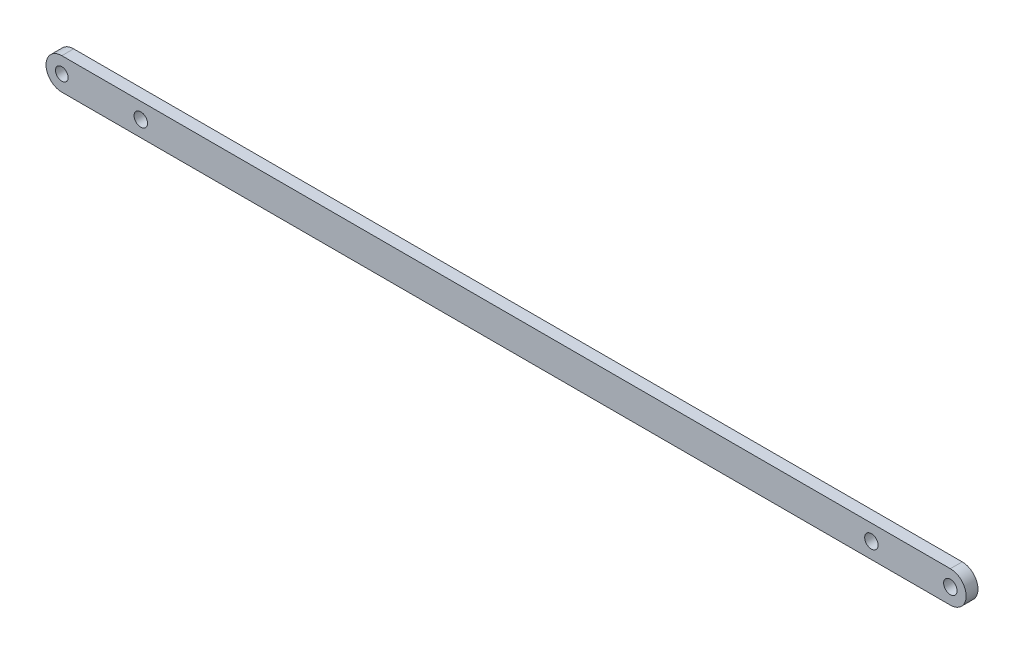
ISO-10303-21;
HEADER;
FILE_DESCRIPTION(('STEP AP214'),'2;1');
FILE_NAME('part.step','',(''),(''),'','','');
FILE_SCHEMA(('AUTOMOTIVE_DESIGN { 1 0 10303 214 1 1 1 1 }'));
ENDSEC;
DATA;
#1=APPLICATION_CONTEXT('core data for automotive mechanical design processes');
#2=APPLICATION_PROTOCOL_DEFINITION('international standard','automotive_design',2000,#1);
#3=PRODUCT_CONTEXT('',#1,'mechanical');
#4=PRODUCT('Part','Part','',(#3));
#5=PRODUCT_RELATED_PRODUCT_CATEGORY('part','',(#4));
#6=PRODUCT_DEFINITION_FORMATION('','',#4);
#7=PRODUCT_DEFINITION_CONTEXT('part definition',#1,'design');
#8=PRODUCT_DEFINITION('design','',#6,#7);
#9=PRODUCT_DEFINITION_SHAPE('','',#8);
#10=(LENGTH_UNIT() NAMED_UNIT(*) SI_UNIT(.MILLI.,.METRE.));
#11=(NAMED_UNIT(*) PLANE_ANGLE_UNIT() SI_UNIT($,.RADIAN.));
#12=(NAMED_UNIT(*) SI_UNIT($,.STERADIAN.) SOLID_ANGLE_UNIT());
#13=UNCERTAINTY_MEASURE_WITH_UNIT(LENGTH_MEASURE(1.E-05),#10,'distance_accuracy_value','');
#14=(GEOMETRIC_REPRESENTATION_CONTEXT(3) GLOBAL_UNCERTAINTY_ASSIGNED_CONTEXT((#13)) GLOBAL_UNIT_ASSIGNED_CONTEXT((#10,
#11,#12)) REPRESENTATION_CONTEXT('',''));
#15=CARTESIAN_POINT('',(0.,0.,0.));
#16=DIRECTION('',(0.,0.,1.));
#17=DIRECTION('',(1.,0.,0.));
#18=AXIS2_PLACEMENT_3D('',#15,#16,#17);
#19=CARTESIAN_POINT('',(171.149757172206,0.,3.));
#20=DIRECTION('',(0.,0.,-1.));
#21=DIRECTION('',(-1.,0.,0.));
#22=AXIS2_PLACEMENT_3D('',#19,#20,#21);
#23=CYLINDRICAL_SURFACE('',#22,4.);
#24=CARTESIAN_POINT('',(171.149757172206,0.,0.));
#25=DIRECTION('',(0.,0.,1.));
#26=DIRECTION('',(1.,0.,0.));
#27=AXIS2_PLACEMENT_3D('',#24,#25,#26);
#28=CIRCLE('',#27,4.);
#29=CARTESIAN_POINT('',(171.149757172206,4.,0.));
#30=VERTEX_POINT('',#29);
#31=CARTESIAN_POINT('',(171.149757172206,-4.,0.));
#32=VERTEX_POINT('',#31);
#33=EDGE_CURVE('E122',#30,#32,#28,.F.);
#34=ORIENTED_EDGE('',*,*,#33,.F.);
#35=DIRECTION('',(0.,0.,-1.));
#36=VECTOR('',#35,1.);
#37=CARTESIAN_POINT('',(171.149757172206,4.,3.));
#38=LINE('',#37,#36);
#39=CARTESIAN_POINT('',(171.149757172206,4.,3.));
#40=VERTEX_POINT('',#39);
#41=EDGE_CURVE('E11',#40,#30,#38,.T.);
#42=ORIENTED_EDGE('',*,*,#41,.F.);
#43=CARTESIAN_POINT('',(171.149757172206,0.,3.));
#44=DIRECTION('',(0.,0.,1.));
#45=DIRECTION('',(1.,0.,0.));
#46=AXIS2_PLACEMENT_3D('',#43,#44,#45);
#47=CIRCLE('',#46,4.);
#48=CARTESIAN_POINT('',(171.149757172206,-4.,3.));
#49=VERTEX_POINT('',#48);
#50=EDGE_CURVE('E103',#40,#49,#47,.F.);
#51=ORIENTED_EDGE('',*,*,#50,.T.);
#52=DIRECTION('',(0.,0.,-1.));
#53=VECTOR('',#52,1.);
#54=CARTESIAN_POINT('',(171.149757172206,-4.,3.));
#55=LINE('',#54,#53);
#56=EDGE_CURVE('E81',#49,#32,#55,.T.);
#57=ORIENTED_EDGE('',*,*,#56,.T.);
#58=EDGE_LOOP('',(#34,#42,#51,#57));
#59=FACE_BOUND('',#58,.T.);
#60=ADVANCED_FACE('F41',(#59),#23,.T.);
#61=CARTESIAN_POINT('',(0.,4.,3.));
#62=DIRECTION('',(0.,1.,0.));
#63=DIRECTION('',(-1.,0.,0.));
#64=AXIS2_PLACEMENT_3D('',#61,#62,#63);
#65=PLANE('',#64);
#66=DIRECTION('',(1.,0.,0.));
#67=VECTOR('',#66,1.);
#68=CARTESIAN_POINT('',(0.,4.,0.));
#69=LINE('',#68,#67);
#70=CARTESIAN_POINT('',(-53.8502428277937,4.,0.));
#71=VERTEX_POINT('',#70);
#72=EDGE_CURVE('E93',#71,#30,#69,.T.);
#73=ORIENTED_EDGE('',*,*,#72,.F.);
#74=DIRECTION('',(0.,0.,-1.));
#75=VECTOR('',#74,1.);
#76=CARTESIAN_POINT('',(-53.8502428277937,4.,3.));
#77=LINE('',#76,#75);
#78=CARTESIAN_POINT('',(-53.8502428277937,4.,3.));
#79=VERTEX_POINT('',#78);
#80=EDGE_CURVE('E50',#79,#71,#77,.T.);
#81=ORIENTED_EDGE('',*,*,#80,.F.);
#82=DIRECTION('',(1.,0.,0.));
#83=VECTOR('',#82,1.);
#84=CARTESIAN_POINT('',(0.,4.,3.));
#85=LINE('',#84,#83);
#86=EDGE_CURVE('E91',#79,#40,#85,.T.);
#87=ORIENTED_EDGE('',*,*,#86,.T.);
#88=ORIENTED_EDGE('',*,*,#41,.T.);
#89=EDGE_LOOP('',(#73,#81,#87,#88));
#90=FACE_BOUND('',#89,.T.);
#91=ADVANCED_FACE('F89',(#90),#65,.T.);
#92=CARTESIAN_POINT('',(-53.8502428277937,0.,3.));
#93=DIRECTION('',(0.,0.,-1.));
#94=DIRECTION('',(-1.,0.,0.));
#95=AXIS2_PLACEMENT_3D('',#92,#93,#94);
#96=CYLINDRICAL_SURFACE('',#95,4.);
#97=CARTESIAN_POINT('',(-53.8502428277937,0.,0.));
#98=DIRECTION('',(0.,0.,1.));
#99=DIRECTION('',(1.,0.,0.));
#100=AXIS2_PLACEMENT_3D('',#97,#98,#99);
#101=CIRCLE('',#100,4.);
#102=CARTESIAN_POINT('',(-53.8502428277937,-4.,0.));
#103=VERTEX_POINT('',#102);
#104=EDGE_CURVE('E125',#71,#103,#101,.T.);
#105=ORIENTED_EDGE('',*,*,#104,.T.);
#106=DIRECTION('',(0.,0.,-1.));
#107=VECTOR('',#106,1.);
#108=CARTESIAN_POINT('',(-53.8502428277937,-4.,3.));
#109=LINE('',#108,#107);
#110=CARTESIAN_POINT('',(-53.8502428277937,-4.,3.));
#111=VERTEX_POINT('',#110);
#112=EDGE_CURVE('E96',#111,#103,#109,.T.);
#113=ORIENTED_EDGE('',*,*,#112,.F.);
#114=CARTESIAN_POINT('',(-53.8502428277937,0.,3.));
#115=DIRECTION('',(0.,0.,1.));
#116=DIRECTION('',(1.,0.,0.));
#117=AXIS2_PLACEMENT_3D('',#114,#115,#116);
#118=CIRCLE('',#117,4.);
#119=EDGE_CURVE('E98',#79,#111,#118,.T.);
#120=ORIENTED_EDGE('',*,*,#119,.F.);
#121=ORIENTED_EDGE('',*,*,#80,.T.);
#122=EDGE_LOOP('',(#105,#113,#120,#121));
#123=FACE_BOUND('',#122,.T.);
#124=ADVANCED_FACE('F99',(#123),#96,.T.);
#125=CARTESIAN_POINT('',(0.,-4.,3.));
#126=DIRECTION('',(0.,1.,0.));
#127=DIRECTION('',(-1.,0.,0.));
#128=AXIS2_PLACEMENT_3D('',#125,#126,#127);
#129=PLANE('',#128);
#130=DIRECTION('',(1.,0.,0.));
#131=VECTOR('',#130,1.);
#132=CARTESIAN_POINT('',(0.,-4.,0.));
#133=LINE('',#132,#131);
#134=EDGE_CURVE('E74',#103,#32,#133,.T.);
#135=ORIENTED_EDGE('',*,*,#134,.T.);
#136=ORIENTED_EDGE('',*,*,#56,.F.);
#137=DIRECTION('',(1.,0.,0.));
#138=VECTOR('',#137,1.);
#139=CARTESIAN_POINT('',(0.,-4.,3.));
#140=LINE('',#139,#138);
#141=EDGE_CURVE('E58',#111,#49,#140,.T.);
#142=ORIENTED_EDGE('',*,*,#141,.F.);
#143=ORIENTED_EDGE('',*,*,#112,.T.);
#144=EDGE_LOOP('',(#135,#136,#142,#143));
#145=FACE_BOUND('',#144,.T.);
#146=ADVANCED_FACE('F134',(#145),#129,.F.);
#147=CARTESIAN_POINT('',(171.149757172206,0.,3.));
#148=DIRECTION('',(0.,0.,-1.));
#149=DIRECTION('',(-1.,0.,0.));
#150=AXIS2_PLACEMENT_3D('',#147,#148,#149);
#151=CYLINDRICAL_SURFACE('',#150,1.70000000000001);
#152=CARTESIAN_POINT('',(171.149757172206,0.,3.));
#153=DIRECTION('',(0.,0.,1.));
#154=DIRECTION('',(1.,0.,0.));
#155=AXIS2_PLACEMENT_3D('',#152,#153,#154);
#156=CIRCLE('',#155,1.70000000000001);
#157=CARTESIAN_POINT('',(172.849757172206,0.,3.));
#158=VERTEX_POINT('',#157);
#159=EDGE_CURVE('E105',#158,#158,#156,.T.);
#160=ORIENTED_EDGE('',*,*,#159,.T.);
#161=EDGE_LOOP('',(#160));
#162=FACE_BOUND('',#161,.T.);
#163=CARTESIAN_POINT('',(171.149757172206,0.,0.));
#164=DIRECTION('',(0.,0.,1.));
#165=DIRECTION('',(1.,0.,0.));
#166=AXIS2_PLACEMENT_3D('',#163,#164,#165);
#167=CIRCLE('',#166,1.70000000000001);
#168=CARTESIAN_POINT('',(172.849757172206,0.,0.));
#169=VERTEX_POINT('',#168);
#170=EDGE_CURVE('E119',#169,#169,#167,.T.);
#171=ORIENTED_EDGE('',*,*,#170,.F.);
#172=EDGE_LOOP('',(#171));
#173=FACE_BOUND('',#172,.T.);
#174=ADVANCED_FACE('F145',(#162,#173),#151,.F.);
#175=CARTESIAN_POINT('',(151.149757172206,0.,3.));
#176=DIRECTION('',(0.,0.,-1.));
#177=DIRECTION('',(-1.,0.,0.));
#178=AXIS2_PLACEMENT_3D('',#175,#176,#177);
#179=CYLINDRICAL_SURFACE('',#178,1.70000000000001);
#180=CARTESIAN_POINT('',(151.149757172206,0.,3.));
#181=DIRECTION('',(0.,0.,1.));
#182=DIRECTION('',(1.,0.,0.));
#183=AXIS2_PLACEMENT_3D('',#180,#181,#182);
#184=CIRCLE('',#183,1.70000000000001);
#185=CARTESIAN_POINT('',(152.849757172206,0.,3.));
#186=VERTEX_POINT('',#185);
#187=EDGE_CURVE('E159',#186,#186,#184,.T.);
#188=ORIENTED_EDGE('',*,*,#187,.T.);
#189=EDGE_LOOP('',(#188));
#190=FACE_BOUND('',#189,.T.);
#191=CARTESIAN_POINT('',(151.149757172206,0.,0.));
#192=DIRECTION('',(0.,0.,1.));
#193=DIRECTION('',(1.,0.,0.));
#194=AXIS2_PLACEMENT_3D('',#191,#192,#193);
#195=CIRCLE('',#194,1.70000000000001);
#196=CARTESIAN_POINT('',(152.849757172206,0.,0.));
#197=VERTEX_POINT('',#196);
#198=EDGE_CURVE('E116',#197,#197,#195,.T.);
#199=ORIENTED_EDGE('',*,*,#198,.F.);
#200=EDGE_LOOP('',(#199));
#201=FACE_BOUND('',#200,.T.);
#202=ADVANCED_FACE('F147',(#190,#201),#179,.F.);
#203=CARTESIAN_POINT('',(-33.8502428277937,0.,3.));
#204=DIRECTION('',(0.,0.,-1.));
#205=DIRECTION('',(-1.,0.,0.));
#206=AXIS2_PLACEMENT_3D('',#203,#204,#205);
#207=CYLINDRICAL_SURFACE('',#206,1.7);
#208=CARTESIAN_POINT('',(-33.8502428277937,0.,3.));
#209=DIRECTION('',(0.,0.,1.));
#210=DIRECTION('',(1.,0.,0.));
#211=AXIS2_PLACEMENT_3D('',#208,#209,#210);
#212=CIRCLE('',#211,1.7);
#213=CARTESIAN_POINT('',(-32.1502428277937,0.,3.));
#214=VERTEX_POINT('',#213);
#215=EDGE_CURVE('E131',#214,#214,#212,.T.);
#216=ORIENTED_EDGE('',*,*,#215,.T.);
#217=EDGE_LOOP('',(#216));
#218=FACE_BOUND('',#217,.T.);
#219=CARTESIAN_POINT('',(-33.8502428277937,0.,0.));
#220=DIRECTION('',(0.,0.,1.));
#221=DIRECTION('',(1.,0.,0.));
#222=AXIS2_PLACEMENT_3D('',#219,#220,#221);
#223=CIRCLE('',#222,1.7);
#224=CARTESIAN_POINT('',(-32.1502428277937,0.,0.));
#225=VERTEX_POINT('',#224);
#226=EDGE_CURVE('E113',#225,#225,#223,.T.);
#227=ORIENTED_EDGE('',*,*,#226,.F.);
#228=EDGE_LOOP('',(#227));
#229=FACE_BOUND('',#228,.T.);
#230=ADVANCED_FACE('F43',(#218,#229),#207,.F.);
#231=CARTESIAN_POINT('',(-53.8502428277937,0.,3.));
#232=DIRECTION('',(0.,0.,-1.));
#233=DIRECTION('',(-1.,0.,0.));
#234=AXIS2_PLACEMENT_3D('',#231,#232,#233);
#235=CYLINDRICAL_SURFACE('',#234,1.6);
#236=CARTESIAN_POINT('',(-53.8502428277937,0.,3.));
#237=DIRECTION('',(0.,0.,1.));
#238=DIRECTION('',(1.,0.,0.));
#239=AXIS2_PLACEMENT_3D('',#236,#237,#238);
#240=CIRCLE('',#239,1.6);
#241=CARTESIAN_POINT('',(-52.2502428277937,0.,3.));
#242=VERTEX_POINT('',#241);
#243=EDGE_CURVE('E110',#242,#242,#240,.T.);
#244=ORIENTED_EDGE('',*,*,#243,.T.);
#245=EDGE_LOOP('',(#244));
#246=FACE_BOUND('',#245,.T.);
#247=CARTESIAN_POINT('',(-53.8502428277937,0.,0.));
#248=DIRECTION('',(0.,0.,1.));
#249=DIRECTION('',(1.,0.,0.));
#250=AXIS2_PLACEMENT_3D('',#247,#248,#249);
#251=CIRCLE('',#250,1.6);
#252=CARTESIAN_POINT('',(-52.2502428277937,0.,0.));
#253=VERTEX_POINT('',#252);
#254=EDGE_CURVE('E128',#253,#253,#251,.T.);
#255=ORIENTED_EDGE('',*,*,#254,.F.);
#256=EDGE_LOOP('',(#255));
#257=FACE_BOUND('',#256,.T.);
#258=ADVANCED_FACE('F154',(#246,#257),#235,.F.);
#259=CARTESIAN_POINT('',(0.,0.,3.));
#260=DIRECTION('',(0.,0.,1.));
#261=DIRECTION('',(1.,0.,0.));
#262=AXIS2_PLACEMENT_3D('',#259,#260,#261);
#263=PLANE('',#262);
#264=ORIENTED_EDGE('',*,*,#215,.F.);
#265=EDGE_LOOP('',(#264));
#266=FACE_BOUND('',#265,.T.);
#267=ORIENTED_EDGE('',*,*,#187,.F.);
#268=EDGE_LOOP('',(#267));
#269=FACE_BOUND('',#268,.T.);
#270=ORIENTED_EDGE('',*,*,#159,.F.);
#271=EDGE_LOOP('',(#270));
#272=FACE_BOUND('',#271,.T.);
#273=ORIENTED_EDGE('',*,*,#50,.F.);
#274=ORIENTED_EDGE('',*,*,#86,.F.);
#275=ORIENTED_EDGE('',*,*,#119,.T.);
#276=ORIENTED_EDGE('',*,*,#141,.T.);
#277=EDGE_LOOP('',(#273,#274,#275,#276));
#278=FACE_BOUND('',#277,.T.);
#279=ORIENTED_EDGE('',*,*,#243,.F.);
#280=EDGE_LOOP('',(#279));
#281=FACE_BOUND('',#280,.T.);
#282=ADVANCED_FACE('F101',(#266,#269,#272,#278,#281),#263,.T.);
#283=CARTESIAN_POINT('',(0.,0.,0.));
#284=DIRECTION('',(0.,0.,1.));
#285=DIRECTION('',(1.,0.,0.));
#286=AXIS2_PLACEMENT_3D('',#283,#284,#285);
#287=PLANE('',#286);
#288=ORIENTED_EDGE('',*,*,#226,.T.);
#289=EDGE_LOOP('',(#288));
#290=FACE_BOUND('',#289,.T.);
#291=ORIENTED_EDGE('',*,*,#198,.T.);
#292=EDGE_LOOP('',(#291));
#293=FACE_BOUND('',#292,.T.);
#294=ORIENTED_EDGE('',*,*,#170,.T.);
#295=EDGE_LOOP('',(#294));
#296=FACE_BOUND('',#295,.T.);
#297=ORIENTED_EDGE('',*,*,#33,.T.);
#298=ORIENTED_EDGE('',*,*,#134,.F.);
#299=ORIENTED_EDGE('',*,*,#104,.F.);
#300=ORIENTED_EDGE('',*,*,#72,.T.);
#301=EDGE_LOOP('',(#297,#298,#299,#300));
#302=FACE_BOUND('',#301,.T.);
#303=ORIENTED_EDGE('',*,*,#254,.T.);
#304=EDGE_LOOP('',(#303));
#305=FACE_BOUND('',#304,.T.);
#306=ADVANCED_FACE('F135',(#290,#293,#296,#302,#305),#287,.F.);
#307=CLOSED_SHELL('',(#60,#91,#124,#146,#174,#202,#230,#258,#282,#306));
#308=MANIFOLD_SOLID_BREP('B2',#307);
#309=ADVANCED_BREP_SHAPE_REPRESENTATION('',(#18,#308),#14);
#310=SHAPE_DEFINITION_REPRESENTATION(#9,#309);
ENDSEC;
END-ISO-10303-21;
